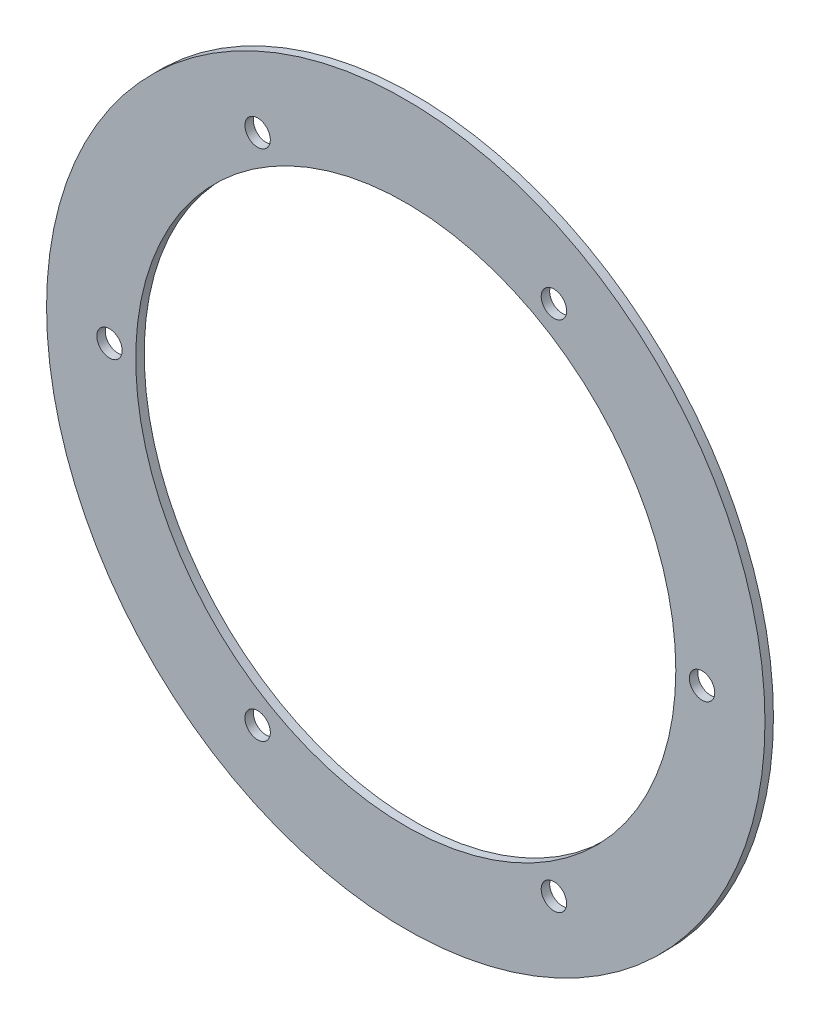
ISO-10303-21;
HEADER;
FILE_DESCRIPTION(('STEP AP214'),'2;1');
FILE_NAME('part.step','',(''),(''),'','','');
FILE_SCHEMA(('AUTOMOTIVE_DESIGN { 1 0 10303 214 1 1 1 1 }'));
ENDSEC;
DATA;
#1=APPLICATION_CONTEXT('core data for automotive mechanical design processes');
#2=APPLICATION_PROTOCOL_DEFINITION('international standard','automotive_design',2000,#1);
#3=PRODUCT_CONTEXT('',#1,'mechanical');
#4=PRODUCT('Part','Part','',(#3));
#5=PRODUCT_RELATED_PRODUCT_CATEGORY('part','',(#4));
#6=PRODUCT_DEFINITION_FORMATION('','',#4);
#7=PRODUCT_DEFINITION_CONTEXT('part definition',#1,'design');
#8=PRODUCT_DEFINITION('design','',#6,#7);
#9=PRODUCT_DEFINITION_SHAPE('','',#8);
#10=(LENGTH_UNIT() NAMED_UNIT(*) SI_UNIT(.MILLI.,.METRE.));
#11=(NAMED_UNIT(*) PLANE_ANGLE_UNIT() SI_UNIT($,.RADIAN.));
#12=(NAMED_UNIT(*) SI_UNIT($,.STERADIAN.) SOLID_ANGLE_UNIT());
#13=UNCERTAINTY_MEASURE_WITH_UNIT(LENGTH_MEASURE(1.E-05),#10,'distance_accuracy_value','');
#14=(GEOMETRIC_REPRESENTATION_CONTEXT(3) GLOBAL_UNCERTAINTY_ASSIGNED_CONTEXT((#13)) GLOBAL_UNIT_ASSIGNED_CONTEXT((#10,
#11,#12)) REPRESENTATION_CONTEXT('',''));
#15=CARTESIAN_POINT('',(0.,0.,0.));
#16=DIRECTION('',(0.,0.,1.));
#17=DIRECTION('',(1.,0.,0.));
#18=AXIS2_PLACEMENT_3D('',#15,#16,#17);
#19=CARTESIAN_POINT('',(0.,0.,1.5));
#20=DIRECTION('',(0.,0.,1.));
#21=DIRECTION('',(1.,0.,0.));
#22=AXIS2_PLACEMENT_3D('',#19,#20,#21);
#23=PLANE('',#22);
#24=CARTESIAN_POINT('',(52.5,0.,1.5));
#25=DIRECTION('',(0.,0.,1.));
#26=DIRECTION('',(1.,0.,0.));
#27=AXIS2_PLACEMENT_3D('',#24,#25,#26);
#28=CIRCLE('',#27,2.24999999999999);
#29=CARTESIAN_POINT('',(54.75,0.,1.5));
#30=VERTEX_POINT('',#29);
#31=EDGE_CURVE('E109',#30,#30,#28,.T.);
#32=ORIENTED_EDGE('',*,*,#31,.F.);
#33=EDGE_LOOP('',(#32));
#34=FACE_BOUND('',#33,.T.);
#35=CARTESIAN_POINT('',(26.2499999999999,-45.4663336986831,1.5));
#36=DIRECTION('',(0.,0.,1.));
#37=DIRECTION('',(1.,0.,0.));
#38=AXIS2_PLACEMENT_3D('',#35,#36,#37);
#39=CIRCLE('',#38,2.24999999999999);
#40=CARTESIAN_POINT('',(28.4999999999999,-45.4663336986831,1.5));
#41=VERTEX_POINT('',#40);
#42=EDGE_CURVE('E101',#41,#41,#39,.T.);
#43=ORIENTED_EDGE('',*,*,#42,.F.);
#44=EDGE_LOOP('',(#43));
#45=FACE_BOUND('',#44,.T.);
#46=CARTESIAN_POINT('',(-26.2500000000002,-45.4663336986829,1.5));
#47=DIRECTION('',(0.,0.,1.));
#48=DIRECTION('',(1.,0.,0.));
#49=AXIS2_PLACEMENT_3D('',#46,#47,#48);
#50=CIRCLE('',#49,2.24999999999999);
#51=CARTESIAN_POINT('',(-24.0000000000002,-45.4663336986829,1.5));
#52=VERTEX_POINT('',#51);
#53=EDGE_CURVE('E93',#52,#52,#50,.T.);
#54=ORIENTED_EDGE('',*,*,#53,.F.);
#55=EDGE_LOOP('',(#54));
#56=FACE_BOUND('',#55,.T.);
#57=CARTESIAN_POINT('',(-52.5,3.66605540578529E-13,1.5));
#58=DIRECTION('',(0.,0.,1.));
#59=DIRECTION('',(1.,0.,0.));
#60=AXIS2_PLACEMENT_3D('',#57,#58,#59);
#61=CIRCLE('',#60,2.24999999999999);
#62=CARTESIAN_POINT('',(-50.25,3.66605540578529E-13,1.5));
#63=VERTEX_POINT('',#62);
#64=EDGE_CURVE('E85',#63,#63,#61,.T.);
#65=ORIENTED_EDGE('',*,*,#64,.F.);
#66=EDGE_LOOP('',(#65));
#67=FACE_BOUND('',#66,.T.);
#68=CARTESIAN_POINT('',(-26.2499999999996,45.4663336986833,1.5));
#69=DIRECTION('',(0.,0.,1.));
#70=DIRECTION('',(1.,0.,0.));
#71=AXIS2_PLACEMENT_3D('',#68,#69,#70);
#72=CIRCLE('',#71,2.24999999999999);
#73=CARTESIAN_POINT('',(-23.9999999999996,45.4663336986833,1.5));
#74=VERTEX_POINT('',#73);
#75=EDGE_CURVE('E77',#74,#74,#72,.T.);
#76=ORIENTED_EDGE('',*,*,#75,.F.);
#77=EDGE_LOOP('',(#76));
#78=FACE_BOUND('',#77,.T.);
#79=CARTESIAN_POINT('',(26.2500000000005,45.4663336986827,1.5));
#80=DIRECTION('',(0.,0.,1.));
#81=DIRECTION('',(1.,0.,0.));
#82=AXIS2_PLACEMENT_3D('',#79,#80,#81);
#83=CIRCLE('',#82,2.24999999999999);
#84=CARTESIAN_POINT('',(28.5000000000005,45.4663336986827,1.5));
#85=VERTEX_POINT('',#84);
#86=EDGE_CURVE('E69',#85,#85,#83,.T.);
#87=ORIENTED_EDGE('',*,*,#86,.F.);
#88=EDGE_LOOP('',(#87));
#89=FACE_BOUND('',#88,.T.);
#90=CARTESIAN_POINT('',(0.,0.,1.5));
#91=DIRECTION('',(0.,0.,1.));
#92=DIRECTION('',(1.,0.,0.));
#93=AXIS2_PLACEMENT_3D('',#90,#91,#92);
#94=CIRCLE('',#93,63.65);
#95=CARTESIAN_POINT('',(63.65,0.,1.5));
#96=VERTEX_POINT('',#95);
#97=EDGE_CURVE('E10',#96,#96,#94,.T.);
#98=ORIENTED_EDGE('',*,*,#97,.T.);
#99=EDGE_LOOP('',(#98));
#100=FACE_BOUND('',#99,.T.);
#101=CARTESIAN_POINT('',(0.,0.,1.5));
#102=DIRECTION('',(0.,0.,1.));
#103=DIRECTION('',(1.,0.,0.));
#104=AXIS2_PLACEMENT_3D('',#101,#102,#103);
#105=CIRCLE('',#104,47.85);
#106=CARTESIAN_POINT('',(47.85,0.,1.5));
#107=VERTEX_POINT('',#106);
#108=EDGE_CURVE('E56',#107,#107,#105,.T.);
#109=ORIENTED_EDGE('',*,*,#108,.F.);
#110=EDGE_LOOP('',(#109));
#111=FACE_BOUND('',#110,.T.);
#112=ADVANCED_FACE('F43',(#34,#45,#56,#67,#78,#89,#100,#111),#23,.T.);
#113=CARTESIAN_POINT('',(0.,0.,0.));
#114=DIRECTION('',(0.,0.,1.));
#115=DIRECTION('',(1.,0.,0.));
#116=AXIS2_PLACEMENT_3D('',#113,#114,#115);
#117=PLANE('',#116);
#118=CARTESIAN_POINT('',(52.5,0.,0.));
#119=DIRECTION('',(0.,0.,1.));
#120=DIRECTION('',(1.,0.,0.));
#121=AXIS2_PLACEMENT_3D('',#118,#119,#120);
#122=CIRCLE('',#121,2.25);
#123=CARTESIAN_POINT('',(54.75,0.,0.));
#124=VERTEX_POINT('',#123);
#125=EDGE_CURVE('E105',#124,#124,#122,.T.);
#126=ORIENTED_EDGE('',*,*,#125,.T.);
#127=EDGE_LOOP('',(#126));
#128=FACE_BOUND('',#127,.T.);
#129=CARTESIAN_POINT('',(26.2499999999999,-45.4663336986831,0.));
#130=DIRECTION('',(0.,0.,1.));
#131=DIRECTION('',(1.,0.,0.));
#132=AXIS2_PLACEMENT_3D('',#129,#130,#131);
#133=CIRCLE('',#132,2.25);
#134=CARTESIAN_POINT('',(28.4999999999999,-45.4663336986831,0.));
#135=VERTEX_POINT('',#134);
#136=EDGE_CURVE('E97',#135,#135,#133,.T.);
#137=ORIENTED_EDGE('',*,*,#136,.T.);
#138=EDGE_LOOP('',(#137));
#139=FACE_BOUND('',#138,.T.);
#140=CARTESIAN_POINT('',(-26.2500000000002,-45.4663336986829,0.));
#141=DIRECTION('',(0.,0.,1.));
#142=DIRECTION('',(1.,0.,0.));
#143=AXIS2_PLACEMENT_3D('',#140,#141,#142);
#144=CIRCLE('',#143,2.25);
#145=CARTESIAN_POINT('',(-24.0000000000002,-45.4663336986829,0.));
#146=VERTEX_POINT('',#145);
#147=EDGE_CURVE('E89',#146,#146,#144,.T.);
#148=ORIENTED_EDGE('',*,*,#147,.T.);
#149=EDGE_LOOP('',(#148));
#150=FACE_BOUND('',#149,.T.);
#151=CARTESIAN_POINT('',(-52.5,3.66605540578529E-13,0.));
#152=DIRECTION('',(0.,0.,1.));
#153=DIRECTION('',(1.,0.,0.));
#154=AXIS2_PLACEMENT_3D('',#151,#152,#153);
#155=CIRCLE('',#154,2.25);
#156=CARTESIAN_POINT('',(-50.25,3.66605540578529E-13,0.));
#157=VERTEX_POINT('',#156);
#158=EDGE_CURVE('E81',#157,#157,#155,.T.);
#159=ORIENTED_EDGE('',*,*,#158,.T.);
#160=EDGE_LOOP('',(#159));
#161=FACE_BOUND('',#160,.T.);
#162=CARTESIAN_POINT('',(-26.2499999999996,45.4663336986833,0.));
#163=DIRECTION('',(0.,0.,1.));
#164=DIRECTION('',(1.,0.,0.));
#165=AXIS2_PLACEMENT_3D('',#162,#163,#164);
#166=CIRCLE('',#165,2.25);
#167=CARTESIAN_POINT('',(-23.9999999999996,45.4663336986833,0.));
#168=VERTEX_POINT('',#167);
#169=EDGE_CURVE('E73',#168,#168,#166,.T.);
#170=ORIENTED_EDGE('',*,*,#169,.T.);
#171=EDGE_LOOP('',(#170));
#172=FACE_BOUND('',#171,.T.);
#173=CARTESIAN_POINT('',(26.2500000000005,45.4663336986827,0.));
#174=DIRECTION('',(0.,0.,1.));
#175=DIRECTION('',(1.,0.,0.));
#176=AXIS2_PLACEMENT_3D('',#173,#174,#175);
#177=CIRCLE('',#176,2.25);
#178=CARTESIAN_POINT('',(28.5000000000005,45.4663336986827,0.));
#179=VERTEX_POINT('',#178);
#180=EDGE_CURVE('E62',#179,#179,#177,.T.);
#181=ORIENTED_EDGE('',*,*,#180,.T.);
#182=EDGE_LOOP('',(#181));
#183=FACE_BOUND('',#182,.T.);
#184=CARTESIAN_POINT('',(0.,0.,0.));
#185=DIRECTION('',(0.,0.,1.));
#186=DIRECTION('',(1.,0.,0.));
#187=AXIS2_PLACEMENT_3D('',#184,#185,#186);
#188=CIRCLE('',#187,63.65);
#189=CARTESIAN_POINT('',(63.65,0.,0.));
#190=VERTEX_POINT('',#189);
#191=EDGE_CURVE('E47',#190,#190,#188,.T.);
#192=ORIENTED_EDGE('',*,*,#191,.F.);
#193=EDGE_LOOP('',(#192));
#194=FACE_BOUND('',#193,.T.);
#195=CARTESIAN_POINT('',(0.,0.,0.));
#196=DIRECTION('',(0.,0.,1.));
#197=DIRECTION('',(1.,0.,0.));
#198=AXIS2_PLACEMENT_3D('',#195,#196,#197);
#199=CIRCLE('',#198,47.85);
#200=CARTESIAN_POINT('',(47.85,0.,0.));
#201=VERTEX_POINT('',#200);
#202=EDGE_CURVE('E58',#201,#201,#199,.T.);
#203=ORIENTED_EDGE('',*,*,#202,.T.);
#204=EDGE_LOOP('',(#203));
#205=FACE_BOUND('',#204,.T.);
#206=ADVANCED_FACE('F118',(#128,#139,#150,#161,#172,#183,#194,#205),#117,.F.);
#207=CARTESIAN_POINT('',(0.,0.,1.5));
#208=DIRECTION('',(0.,0.,-1.));
#209=DIRECTION('',(-1.,0.,0.));
#210=AXIS2_PLACEMENT_3D('',#207,#208,#209);
#211=CYLINDRICAL_SURFACE('',#210,63.65);
#212=ORIENTED_EDGE('',*,*,#97,.F.);
#213=EDGE_LOOP('',(#212));
#214=FACE_BOUND('',#213,.T.);
#215=ORIENTED_EDGE('',*,*,#191,.T.);
#216=EDGE_LOOP('',(#215));
#217=FACE_BOUND('',#216,.T.);
#218=ADVANCED_FACE('F45',(#214,#217),#211,.T.);
#219=CARTESIAN_POINT('',(0.,0.,1.5));
#220=DIRECTION('',(0.,0.,-1.));
#221=DIRECTION('',(-1.,0.,0.));
#222=AXIS2_PLACEMENT_3D('',#219,#220,#221);
#223=CYLINDRICAL_SURFACE('',#222,47.85);
#224=ORIENTED_EDGE('',*,*,#108,.T.);
#225=EDGE_LOOP('',(#224));
#226=FACE_BOUND('',#225,.T.);
#227=ORIENTED_EDGE('',*,*,#202,.F.);
#228=EDGE_LOOP('',(#227));
#229=FACE_BOUND('',#228,.T.);
#230=ADVANCED_FACE('F132',(#226,#229),#223,.F.);
#231=CARTESIAN_POINT('',(26.2500000000005,45.4663336986827,1.5));
#232=DIRECTION('',(0.,0.,1.));
#233=DIRECTION('',(1.,0.,0.));
#234=AXIS2_PLACEMENT_3D('',#231,#232,#233);
#235=CYLINDRICAL_SURFACE('',#234,2.24999999999999);
#236=ORIENTED_EDGE('',*,*,#180,.F.);
#237=EDGE_LOOP('',(#236));
#238=FACE_BOUND('',#237,.T.);
#239=ORIENTED_EDGE('',*,*,#86,.T.);
#240=EDGE_LOOP('',(#239));
#241=FACE_BOUND('',#240,.T.);
#242=ADVANCED_FACE('F135',(#238,#241),#235,.F.);
#243=CARTESIAN_POINT('',(-26.2499999999996,45.4663336986833,1.5));
#244=DIRECTION('',(0.,0.,1.));
#245=DIRECTION('',(1.,0.,0.));
#246=AXIS2_PLACEMENT_3D('',#243,#244,#245);
#247=CYLINDRICAL_SURFACE('',#246,2.24999999999999);
#248=ORIENTED_EDGE('',*,*,#169,.F.);
#249=EDGE_LOOP('',(#248));
#250=FACE_BOUND('',#249,.T.);
#251=ORIENTED_EDGE('',*,*,#75,.T.);
#252=EDGE_LOOP('',(#251));
#253=FACE_BOUND('',#252,.T.);
#254=ADVANCED_FACE('F149',(#250,#253),#247,.F.);
#255=CARTESIAN_POINT('',(-52.5,3.66605540578529E-13,1.5));
#256=DIRECTION('',(0.,0.,1.));
#257=DIRECTION('',(1.,0.,0.));
#258=AXIS2_PLACEMENT_3D('',#255,#256,#257);
#259=CYLINDRICAL_SURFACE('',#258,2.25);
#260=ORIENTED_EDGE('',*,*,#158,.F.);
#261=EDGE_LOOP('',(#260));
#262=FACE_BOUND('',#261,.T.);
#263=ORIENTED_EDGE('',*,*,#64,.T.);
#264=EDGE_LOOP('',(#263));
#265=FACE_BOUND('',#264,.T.);
#266=ADVANCED_FACE('F153',(#262,#265),#259,.F.);
#267=CARTESIAN_POINT('',(-26.2500000000002,-45.4663336986829,1.5));
#268=DIRECTION('',(0.,0.,1.));
#269=DIRECTION('',(1.,0.,0.));
#270=AXIS2_PLACEMENT_3D('',#267,#268,#269);
#271=CYLINDRICAL_SURFACE('',#270,2.24999999999999);
#272=ORIENTED_EDGE('',*,*,#147,.F.);
#273=EDGE_LOOP('',(#272));
#274=FACE_BOUND('',#273,.T.);
#275=ORIENTED_EDGE('',*,*,#53,.T.);
#276=EDGE_LOOP('',(#275));
#277=FACE_BOUND('',#276,.T.);
#278=ADVANCED_FACE('F157',(#274,#277),#271,.F.);
#279=CARTESIAN_POINT('',(26.2499999999999,-45.4663336986831,1.5));
#280=DIRECTION('',(0.,0.,1.));
#281=DIRECTION('',(1.,0.,0.));
#282=AXIS2_PLACEMENT_3D('',#279,#280,#281);
#283=CYLINDRICAL_SURFACE('',#282,2.24999999999999);
#284=ORIENTED_EDGE('',*,*,#136,.F.);
#285=EDGE_LOOP('',(#284));
#286=FACE_BOUND('',#285,.T.);
#287=ORIENTED_EDGE('',*,*,#42,.T.);
#288=EDGE_LOOP('',(#287));
#289=FACE_BOUND('',#288,.T.);
#290=ADVANCED_FACE('F161',(#286,#289),#283,.F.);
#291=CARTESIAN_POINT('',(52.5,0.,1.5));
#292=DIRECTION('',(0.,0.,1.));
#293=DIRECTION('',(1.,0.,0.));
#294=AXIS2_PLACEMENT_3D('',#291,#292,#293);
#295=CYLINDRICAL_SURFACE('',#294,2.25);
#296=ORIENTED_EDGE('',*,*,#125,.F.);
#297=EDGE_LOOP('',(#296));
#298=FACE_BOUND('',#297,.T.);
#299=ORIENTED_EDGE('',*,*,#31,.T.);
#300=EDGE_LOOP('',(#299));
#301=FACE_BOUND('',#300,.T.);
#302=ADVANCED_FACE('F114',(#298,#301),#295,.F.);
#303=CLOSED_SHELL('',(#112,#206,#218,#230,#242,#254,#266,#278,#290,#302));
#304=MANIFOLD_SOLID_BREP('B2',#303);
#305=ADVANCED_BREP_SHAPE_REPRESENTATION('',(#18,#304),#14);
#306=SHAPE_DEFINITION_REPRESENTATION(#9,#305);
ENDSEC;
END-ISO-10303-21;
